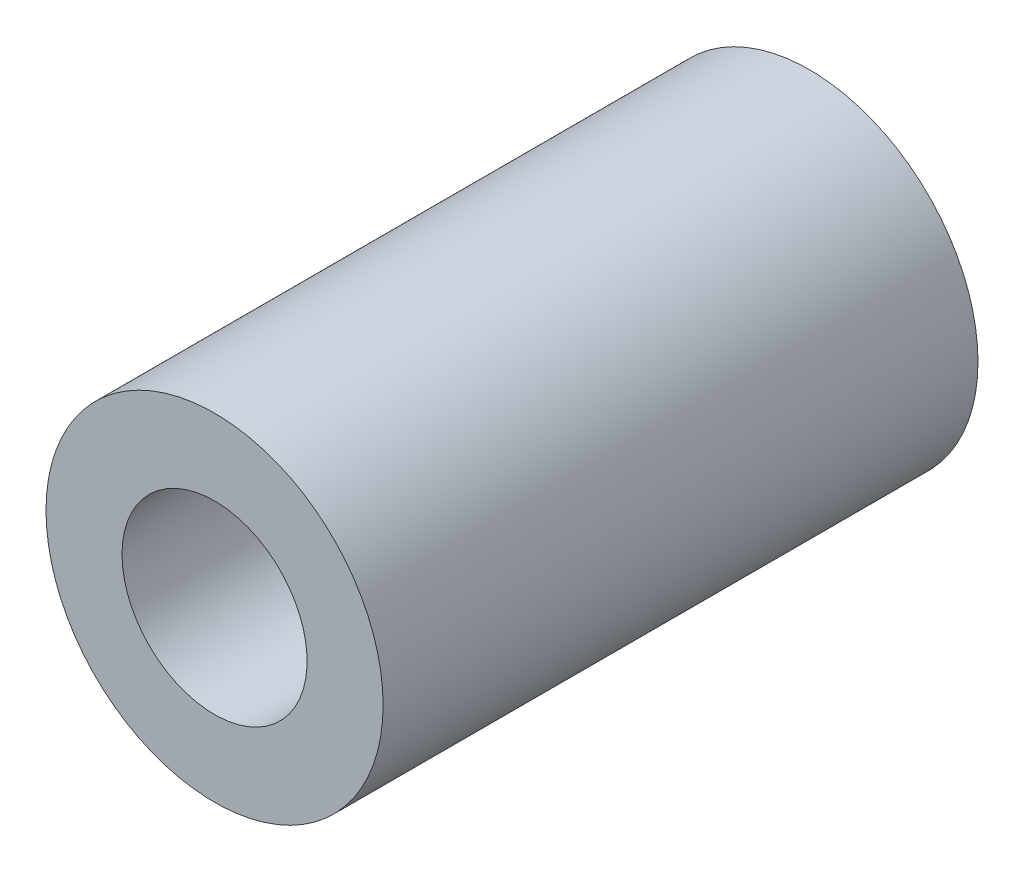
ISO-10303-21;
HEADER;
FILE_DESCRIPTION(('STEP AP214'),'2;1');
FILE_NAME('part.step','',(''),(''),'','','');
FILE_SCHEMA(('AUTOMOTIVE_DESIGN { 1 0 10303 214 1 1 1 1 }'));
ENDSEC;
DATA;
#1=APPLICATION_CONTEXT('core data for automotive mechanical design processes');
#2=APPLICATION_PROTOCOL_DEFINITION('international standard','automotive_design',2000,#1);
#3=PRODUCT_CONTEXT('',#1,'mechanical');
#4=PRODUCT('Part','Part','',(#3));
#5=PRODUCT_RELATED_PRODUCT_CATEGORY('part','',(#4));
#6=PRODUCT_DEFINITION_FORMATION('','',#4);
#7=PRODUCT_DEFINITION_CONTEXT('part definition',#1,'design');
#8=PRODUCT_DEFINITION('design','',#6,#7);
#9=PRODUCT_DEFINITION_SHAPE('','',#8);
#10=(LENGTH_UNIT() NAMED_UNIT(*) SI_UNIT(.MILLI.,.METRE.));
#11=(NAMED_UNIT(*) PLANE_ANGLE_UNIT() SI_UNIT($,.RADIAN.));
#12=(NAMED_UNIT(*) SI_UNIT($,.STERADIAN.) SOLID_ANGLE_UNIT());
#13=UNCERTAINTY_MEASURE_WITH_UNIT(LENGTH_MEASURE(1.E-05),#10,'distance_accuracy_value','');
#14=(GEOMETRIC_REPRESENTATION_CONTEXT(3) GLOBAL_UNCERTAINTY_ASSIGNED_CONTEXT((#13)) GLOBAL_UNIT_ASSIGNED_CONTEXT((#10,
#11,#12)) REPRESENTATION_CONTEXT('',''));
#15=CARTESIAN_POINT('',(0.,0.,0.));
#16=DIRECTION('',(0.,0.,1.));
#17=DIRECTION('',(1.,0.,0.));
#18=AXIS2_PLACEMENT_3D('',#15,#16,#17);
#19=CARTESIAN_POINT('',(0.,0.,45.));
#20=DIRECTION('',(0.,0.,1.));
#21=DIRECTION('',(1.,0.,0.));
#22=AXIS2_PLACEMENT_3D('',#19,#20,#21);
#23=PLANE('',#22);
#24=CARTESIAN_POINT('',(0.,0.,45.));
#25=DIRECTION('',(0.,0.,1.));
#26=DIRECTION('',(1.,0.,0.));
#27=AXIS2_PLACEMENT_3D('',#24,#25,#26);
#28=CIRCLE('',#27,12.75);
#29=CARTESIAN_POINT('',(-12.75,0.,45.));
#30=VERTEX_POINT('',#29);
#31=EDGE_CURVE('E10',#30,#30,#28,.T.);
#32=ORIENTED_EDGE('',*,*,#31,.T.);
#33=EDGE_LOOP('',(#32));
#34=FACE_BOUND('',#33,.T.);
#35=CARTESIAN_POINT('',(0.,0.,45.));
#36=DIRECTION('',(0.,0.,1.));
#37=DIRECTION('',(1.,0.,0.));
#38=AXIS2_PLACEMENT_3D('',#35,#36,#37);
#39=CIRCLE('',#38,7.);
#40=CARTESIAN_POINT('',(-7.,0.,45.));
#41=VERTEX_POINT('',#40);
#42=EDGE_CURVE('E44',#41,#41,#39,.T.);
#43=ORIENTED_EDGE('',*,*,#42,.F.);
#44=EDGE_LOOP('',(#43));
#45=FACE_BOUND('',#44,.T.);
#46=ADVANCED_FACE('F33',(#34,#45),#23,.T.);
#47=CARTESIAN_POINT('',(0.,0.,0.));
#48=DIRECTION('',(0.,0.,1.));
#49=DIRECTION('',(1.,0.,0.));
#50=AXIS2_PLACEMENT_3D('',#47,#48,#49);
#51=PLANE('',#50);
#52=CARTESIAN_POINT('',(0.,0.,0.));
#53=DIRECTION('',(0.,0.,1.));
#54=DIRECTION('',(1.,0.,0.));
#55=AXIS2_PLACEMENT_3D('',#52,#53,#54);
#56=CIRCLE('',#55,12.75);
#57=CARTESIAN_POINT('',(-12.75,0.,0.));
#58=VERTEX_POINT('',#57);
#59=EDGE_CURVE('E37',#58,#58,#56,.T.);
#60=ORIENTED_EDGE('',*,*,#59,.F.);
#61=EDGE_LOOP('',(#60));
#62=FACE_BOUND('',#61,.T.);
#63=CARTESIAN_POINT('',(0.,0.,0.));
#64=DIRECTION('',(0.,0.,1.));
#65=DIRECTION('',(1.,0.,0.));
#66=AXIS2_PLACEMENT_3D('',#63,#64,#65);
#67=CIRCLE('',#66,7.);
#68=CARTESIAN_POINT('',(-7.,0.,0.));
#69=VERTEX_POINT('',#68);
#70=EDGE_CURVE('E46',#69,#69,#67,.T.);
#71=ORIENTED_EDGE('',*,*,#70,.T.);
#72=EDGE_LOOP('',(#71));
#73=FACE_BOUND('',#72,.T.);
#74=ADVANCED_FACE('F56',(#62,#73),#51,.F.);
#75=CARTESIAN_POINT('',(0.,0.,45.));
#76=DIRECTION('',(0.,0.,-1.));
#77=DIRECTION('',(-1.,0.,0.));
#78=AXIS2_PLACEMENT_3D('',#75,#76,#77);
#79=CYLINDRICAL_SURFACE('',#78,12.75);
#80=CARTESIAN_POINT('',(-12.75,0.,45.));
#81=CARTESIAN_POINT('',(-12.75,0.,44.53125));
#82=CARTESIAN_POINT('',(-12.75,0.,44.0625));
#83=CARTESIAN_POINT('',(-12.75,0.,43.125));
#84=CARTESIAN_POINT('',(-12.75,0.,42.65625));
#85=CARTESIAN_POINT('',(-12.75,0.,41.71875));
#86=CARTESIAN_POINT('',(-12.75,0.,41.25));
#87=CARTESIAN_POINT('',(-12.75,0.,40.3125));
#88=CARTESIAN_POINT('',(-12.75,0.,39.84375));
#89=CARTESIAN_POINT('',(-12.75,0.,38.90625));
#90=CARTESIAN_POINT('',(-12.75,0.,38.4375));
#91=CARTESIAN_POINT('',(-12.75,0.,37.5));
#92=CARTESIAN_POINT('',(-12.75,0.,37.03125));
#93=CARTESIAN_POINT('',(-12.75,0.,36.09375));
#94=CARTESIAN_POINT('',(-12.75,0.,35.625));
#95=CARTESIAN_POINT('',(-12.75,0.,34.6875));
#96=CARTESIAN_POINT('',(-12.75,0.,34.21875));
#97=CARTESIAN_POINT('',(-12.75,0.,33.28125));
#98=CARTESIAN_POINT('',(-12.75,0.,32.8125));
#99=CARTESIAN_POINT('',(-12.75,0.,31.875));
#100=CARTESIAN_POINT('',(-12.75,0.,31.40625));
#101=CARTESIAN_POINT('',(-12.75,0.,30.46875));
#102=CARTESIAN_POINT('',(-12.75,0.,30.));
#103=CARTESIAN_POINT('',(-12.75,0.,29.0625));
#104=CARTESIAN_POINT('',(-12.75,0.,28.59375));
#105=CARTESIAN_POINT('',(-12.75,0.,27.65625));
#106=CARTESIAN_POINT('',(-12.75,0.,27.1875));
#107=CARTESIAN_POINT('',(-12.75,0.,26.25));
#108=CARTESIAN_POINT('',(-12.75,0.,25.78125));
#109=CARTESIAN_POINT('',(-12.75,0.,24.84375));
#110=CARTESIAN_POINT('',(-12.75,0.,24.375));
#111=CARTESIAN_POINT('',(-12.75,0.,23.4375));
#112=CARTESIAN_POINT('',(-12.75,0.,22.96875));
#113=CARTESIAN_POINT('',(-12.75,0.,22.03125));
#114=CARTESIAN_POINT('',(-12.75,0.,21.5625));
#115=CARTESIAN_POINT('',(-12.75,0.,20.625));
#116=CARTESIAN_POINT('',(-12.75,0.,20.15625));
#117=CARTESIAN_POINT('',(-12.75,0.,19.21875));
#118=CARTESIAN_POINT('',(-12.75,0.,18.75));
#119=CARTESIAN_POINT('',(-12.75,0.,17.8125));
#120=CARTESIAN_POINT('',(-12.75,0.,17.34375));
#121=CARTESIAN_POINT('',(-12.75,0.,16.40625));
#122=CARTESIAN_POINT('',(-12.75,0.,15.9375));
#123=CARTESIAN_POINT('',(-12.75,0.,15.));
#124=CARTESIAN_POINT('',(-12.75,0.,14.53125));
#125=CARTESIAN_POINT('',(-12.75,0.,13.59375));
#126=CARTESIAN_POINT('',(-12.75,0.,13.125));
#127=CARTESIAN_POINT('',(-12.75,0.,12.1875));
#128=CARTESIAN_POINT('',(-12.75,0.,11.71875));
#129=CARTESIAN_POINT('',(-12.75,0.,10.78125));
#130=CARTESIAN_POINT('',(-12.75,0.,10.3125));
#131=CARTESIAN_POINT('',(-12.75,0.,9.37499999999999));
#132=CARTESIAN_POINT('',(-12.75,0.,8.90624999999999));
#133=CARTESIAN_POINT('',(-12.75,0.,7.96874999999999));
#134=CARTESIAN_POINT('',(-12.75,0.,7.5));
#135=CARTESIAN_POINT('',(-12.75,0.,6.56249999999999));
#136=CARTESIAN_POINT('',(-12.75,0.,6.09374999999999));
#137=CARTESIAN_POINT('',(-12.75,0.,5.15624999999999));
#138=CARTESIAN_POINT('',(-12.75,0.,4.68749999999999));
#139=CARTESIAN_POINT('',(-12.75,0.,3.74999999999999));
#140=CARTESIAN_POINT('',(-12.75,0.,3.28124999999999));
#141=CARTESIAN_POINT('',(-12.75,0.,2.34374999999999));
#142=CARTESIAN_POINT('',(-12.75,0.,1.87499999999999));
#143=CARTESIAN_POINT('',(-12.75,0.,0.937499999999992));
#144=CARTESIAN_POINT('',(-12.75,0.,0.468749999999993));
#145=CARTESIAN_POINT('',(-12.75,0.,0.));
#146=B_SPLINE_CURVE_WITH_KNOTS('',3,(#80,#81,#82,#83,#84,#85,#86,#87,#88,#89,#90,#91,#92,#93,
#94,#95,#96,#97,#98,#99,#100,#101,#102,#103,#104,#105,#106,#107,#108,#109,#110,#111,#112,#113,
#114,#115,#116,#117,#118,#119,#120,#121,#122,#123,#124,#125,#126,#127,#128,#129,#130,#131,#132,
#133,#134,#135,#136,#137,#138,#139,#140,#141,#142,#143,#144,#145),.UNSPECIFIED.,.F.,.F.,(4,2,2,
2,2,2,2,2,2,2,2,2,2,2,2,2,2,2,2,2,2,2,2,2,2,2,2,2,2,2,2,2,4),(0.,1.40625,2.8125,
4.21874999999999,5.625,7.03125,8.43749999999999,9.84375,11.25,12.65625,14.0625,15.46875,16.875,
18.28125,19.6875,21.09375,22.5,23.90625,25.3125,26.71875,28.125,29.53125,30.9375,32.34375,33.75,
35.15625,36.5625,37.96875,39.375,40.78125,42.1875,43.59375,45.),.UNSPECIFIED.);
#147=EDGE_CURVE('BSEAM35',#30,#58,#146,.T.);
#148=ORIENTED_EDGE('',*,*,#31,.F.);
#149=ORIENTED_EDGE('',*,*,#59,.T.);
#150=ORIENTED_EDGE('',*,*,#147,.T.);
#151=ORIENTED_EDGE('',*,*,#147,.F.);
#152=EDGE_LOOP('',(#148,#150,#149,#151));
#153=FACE_BOUND('',#152,.T.);
#154=ADVANCED_FACE('F35',(#153),#79,.T.);
#155=CARTESIAN_POINT('',(0.,0.,45.));
#156=DIRECTION('',(0.,0.,-1.));
#157=DIRECTION('',(-1.,0.,0.));
#158=AXIS2_PLACEMENT_3D('',#155,#156,#157);
#159=CYLINDRICAL_SURFACE('',#158,7.);
#160=CARTESIAN_POINT('',(-7.,0.,45.));
#161=CARTESIAN_POINT('',(-7.,0.,44.53125));
#162=CARTESIAN_POINT('',(-7.,0.,44.0625));
#163=CARTESIAN_POINT('',(-7.,0.,43.125));
#164=CARTESIAN_POINT('',(-7.,0.,42.65625));
#165=CARTESIAN_POINT('',(-7.,0.,41.71875));
#166=CARTESIAN_POINT('',(-7.,0.,41.25));
#167=CARTESIAN_POINT('',(-7.,0.,40.3125));
#168=CARTESIAN_POINT('',(-7.,0.,39.84375));
#169=CARTESIAN_POINT('',(-7.,0.,38.90625));
#170=CARTESIAN_POINT('',(-7.,0.,38.4375));
#171=CARTESIAN_POINT('',(-7.,0.,37.5));
#172=CARTESIAN_POINT('',(-7.,0.,37.03125));
#173=CARTESIAN_POINT('',(-7.,0.,36.09375));
#174=CARTESIAN_POINT('',(-7.,0.,35.625));
#175=CARTESIAN_POINT('',(-7.,0.,34.6875));
#176=CARTESIAN_POINT('',(-7.,0.,34.21875));
#177=CARTESIAN_POINT('',(-7.,0.,33.28125));
#178=CARTESIAN_POINT('',(-7.,0.,32.8125));
#179=CARTESIAN_POINT('',(-7.,0.,31.875));
#180=CARTESIAN_POINT('',(-7.,0.,31.40625));
#181=CARTESIAN_POINT('',(-7.,0.,30.46875));
#182=CARTESIAN_POINT('',(-7.,0.,30.));
#183=CARTESIAN_POINT('',(-7.,0.,29.0625));
#184=CARTESIAN_POINT('',(-7.,0.,28.59375));
#185=CARTESIAN_POINT('',(-7.,0.,27.65625));
#186=CARTESIAN_POINT('',(-7.,0.,27.1875));
#187=CARTESIAN_POINT('',(-7.,0.,26.25));
#188=CARTESIAN_POINT('',(-7.,0.,25.78125));
#189=CARTESIAN_POINT('',(-7.,0.,24.84375));
#190=CARTESIAN_POINT('',(-7.,0.,24.375));
#191=CARTESIAN_POINT('',(-7.,0.,23.4375));
#192=CARTESIAN_POINT('',(-7.,0.,22.96875));
#193=CARTESIAN_POINT('',(-7.,0.,22.03125));
#194=CARTESIAN_POINT('',(-7.,0.,21.5625));
#195=CARTESIAN_POINT('',(-7.,0.,20.625));
#196=CARTESIAN_POINT('',(-7.,0.,20.15625));
#197=CARTESIAN_POINT('',(-7.,0.,19.21875));
#198=CARTESIAN_POINT('',(-7.,0.,18.75));
#199=CARTESIAN_POINT('',(-7.,0.,17.8125));
#200=CARTESIAN_POINT('',(-7.,0.,17.34375));
#201=CARTESIAN_POINT('',(-7.,0.,16.40625));
#202=CARTESIAN_POINT('',(-7.,0.,15.9375));
#203=CARTESIAN_POINT('',(-7.,0.,15.));
#204=CARTESIAN_POINT('',(-7.,0.,14.53125));
#205=CARTESIAN_POINT('',(-7.,0.,13.59375));
#206=CARTESIAN_POINT('',(-7.,0.,13.125));
#207=CARTESIAN_POINT('',(-7.,0.,12.1875));
#208=CARTESIAN_POINT('',(-7.,0.,11.71875));
#209=CARTESIAN_POINT('',(-7.,0.,10.78125));
#210=CARTESIAN_POINT('',(-7.,0.,10.3125));
#211=CARTESIAN_POINT('',(-7.,0.,9.375));
#212=CARTESIAN_POINT('',(-7.,0.,8.90625));
#213=CARTESIAN_POINT('',(-7.,0.,7.96874999999999));
#214=CARTESIAN_POINT('',(-7.,0.,7.5));
#215=CARTESIAN_POINT('',(-7.,0.,6.5625));
#216=CARTESIAN_POINT('',(-7.,0.,6.09375));
#217=CARTESIAN_POINT('',(-7.,0.,5.15625));
#218=CARTESIAN_POINT('',(-7.,0.,4.68749999999999));
#219=CARTESIAN_POINT('',(-7.,0.,3.74999999999999));
#220=CARTESIAN_POINT('',(-7.,0.,3.28124999999999));
#221=CARTESIAN_POINT('',(-7.,0.,2.34374999999999));
#222=CARTESIAN_POINT('',(-7.,0.,1.87499999999999));
#223=CARTESIAN_POINT('',(-7.,0.,0.937499999999992));
#224=CARTESIAN_POINT('',(-7.,0.,0.468749999999993));
#225=CARTESIAN_POINT('',(-7.,0.,0.));
#226=B_SPLINE_CURVE_WITH_KNOTS('',3,(#160,#161,#162,#163,#164,#165,#166,#167,#168,#169,#170,
#171,#172,#173,#174,#175,#176,#177,#178,#179,#180,#181,#182,#183,#184,#185,#186,#187,#188,#189,
#190,#191,#192,#193,#194,#195,#196,#197,#198,#199,#200,#201,#202,#203,#204,#205,#206,#207,#208,
#209,#210,#211,#212,#213,#214,#215,#216,#217,#218,#219,#220,#221,#222,#223,#224,#225),
.UNSPECIFIED.,.F.,.F.,(4,2,2,2,2,2,2,2,2,2,2,2,2,2,2,2,2,2,2,2,2,2,2,2,2,2,2,2,2,2,2,2,4),(0.,
1.40625,2.8125,4.21875000000001,5.62500000000001,7.03125,8.4375,9.84375000000001,11.25,12.65625,
14.0625,15.46875,16.875,18.28125,19.6875,21.09375,22.5,23.90625,25.3125,26.71875,28.125,
29.53125,30.9375,32.34375,33.75,35.15625,36.5625,37.96875,39.375,40.78125,42.1875,43.59375,45.),.UNSPECIFIED.);
#227=EDGE_CURVE('BSEAM52',#41,#69,#226,.T.);
#228=ORIENTED_EDGE('',*,*,#42,.T.);
#229=ORIENTED_EDGE('',*,*,#70,.F.);
#230=ORIENTED_EDGE('',*,*,#227,.T.);
#231=ORIENTED_EDGE('',*,*,#227,.F.);
#232=EDGE_LOOP('',(#228,#230,#229,#231));
#233=FACE_BOUND('',#232,.T.);
#234=ADVANCED_FACE('F52',(#233),#159,.F.);
#235=CLOSED_SHELL('',(#46,#74,#154,#234));
#236=MANIFOLD_SOLID_BREP('B2',#235);
#237=ADVANCED_BREP_SHAPE_REPRESENTATION('',(#18,#236),#14);
#238=SHAPE_DEFINITION_REPRESENTATION(#9,#237);
ENDSEC;
END-ISO-10303-21;
